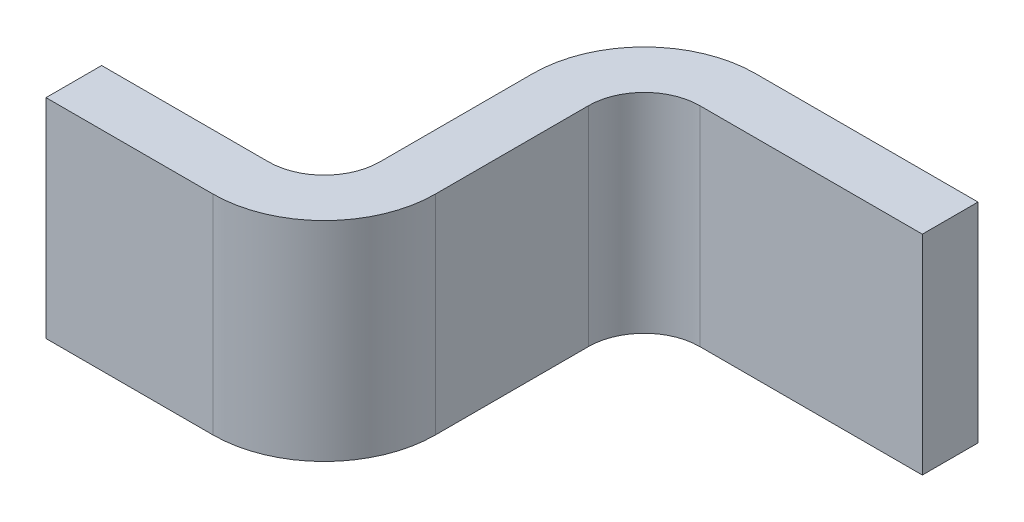
ISO-10303-21;
HEADER;
FILE_DESCRIPTION(('STEP AP214'),'2;1');
FILE_NAME('part.step','',(''),(''),'','','');
FILE_SCHEMA(('AUTOMOTIVE_DESIGN { 1 0 10303 214 1 1 1 1 }'));
ENDSEC;
DATA;
#1=APPLICATION_CONTEXT('core data for automotive mechanical design processes');
#2=APPLICATION_PROTOCOL_DEFINITION('international standard','automotive_design',2000,#1);
#3=PRODUCT_CONTEXT('',#1,'mechanical');
#4=PRODUCT('Part','Part','',(#3));
#5=PRODUCT_RELATED_PRODUCT_CATEGORY('part','',(#4));
#6=PRODUCT_DEFINITION_FORMATION('','',#4);
#7=PRODUCT_DEFINITION_CONTEXT('part definition',#1,'design');
#8=PRODUCT_DEFINITION('design','',#6,#7);
#9=PRODUCT_DEFINITION_SHAPE('','',#8);
#10=(LENGTH_UNIT() NAMED_UNIT(*) SI_UNIT(.MILLI.,.METRE.));
#11=(NAMED_UNIT(*) PLANE_ANGLE_UNIT() SI_UNIT($,.RADIAN.));
#12=(NAMED_UNIT(*) SI_UNIT($,.STERADIAN.) SOLID_ANGLE_UNIT());
#13=UNCERTAINTY_MEASURE_WITH_UNIT(LENGTH_MEASURE(1.E-05),#10,'distance_accuracy_value','');
#14=(GEOMETRIC_REPRESENTATION_CONTEXT(3) GLOBAL_UNCERTAINTY_ASSIGNED_CONTEXT((#13)) GLOBAL_UNIT_ASSIGNED_CONTEXT((#10,
#11,#12)) REPRESENTATION_CONTEXT('',''));
#15=CARTESIAN_POINT('',(0.,0.,0.));
#16=DIRECTION('',(0.,0.,1.));
#17=DIRECTION('',(1.,0.,0.));
#18=AXIS2_PLACEMENT_3D('',#15,#16,#17);
#19=CARTESIAN_POINT('',(0.,0.1875,0.675));
#20=DIRECTION('',(0.,0.,-1.));
#21=DIRECTION('',(-1.,0.,0.));
#22=AXIS2_PLACEMENT_3D('',#19,#20,#21);
#23=PLANE('',#22);
#24=DIRECTION('',(1.,0.,0.));
#25=VECTOR('',#24,1.);
#26=CARTESIAN_POINT('',(0.,0.1875,0.675));
#27=LINE('',#26,#25);
#28=CARTESIAN_POINT('',(0.3,0.1875,0.675));
#29=VERTEX_POINT('',#28);
#30=CARTESIAN_POINT('',(0.,0.1875,0.675));
#31=VERTEX_POINT('',#30);
#32=EDGE_CURVE('E104',#29,#31,#27,.F.);
#33=ORIENTED_EDGE('',*,*,#32,.T.);
#34=DIRECTION('',(0.,1.,0.));
#35=VECTOR('',#34,1.);
#36=CARTESIAN_POINT('',(0.,-0.1875,0.675));
#37=LINE('',#36,#35);
#38=CARTESIAN_POINT('',(0.,-0.1875,0.675));
#39=VERTEX_POINT('',#38);
#40=EDGE_CURVE('E113',#39,#31,#37,.T.);
#41=ORIENTED_EDGE('',*,*,#40,.F.);
#42=DIRECTION('',(1.,0.,0.));
#43=VECTOR('',#42,1.);
#44=CARTESIAN_POINT('',(0.,-0.1875,0.675));
#45=LINE('',#44,#43);
#46=CARTESIAN_POINT('',(0.3,-0.1875,0.675));
#47=VERTEX_POINT('',#46);
#48=EDGE_CURVE('E118',#39,#47,#45,.T.);
#49=ORIENTED_EDGE('',*,*,#48,.T.);
#50=DIRECTION('',(0.,1.,0.));
#51=VECTOR('',#50,1.);
#52=CARTESIAN_POINT('',(0.3,0.1875,0.675));
#53=LINE('',#52,#51);
#54=EDGE_CURVE('E116',#29,#47,#53,.F.);
#55=ORIENTED_EDGE('',*,*,#54,.F.);
#56=EDGE_LOOP('',(#33,#41,#49,#55));
#57=FACE_BOUND('',#56,.T.);
#58=ADVANCED_FACE('F17',(#57),#23,.F.);
#59=CARTESIAN_POINT('',(0.,-0.1875,0.575));
#60=DIRECTION('',(-1.,0.,0.));
#61=DIRECTION('',(0.,0.,1.));
#62=AXIS2_PLACEMENT_3D('',#59,#60,#61);
#63=PLANE('',#62);
#64=DIRECTION('',(0.,0.,1.));
#65=VECTOR('',#64,1.);
#66=CARTESIAN_POINT('',(0.,0.1875,0.575));
#67=LINE('',#66,#65);
#68=CARTESIAN_POINT('',(0.,0.1875,0.575));
#69=VERTEX_POINT('',#68);
#70=EDGE_CURVE('E111',#31,#69,#67,.F.);
#71=ORIENTED_EDGE('',*,*,#70,.T.);
#72=DIRECTION('',(0.,1.,0.));
#73=VECTOR('',#72,1.);
#74=CARTESIAN_POINT('',(0.,-0.1875,0.575));
#75=LINE('',#74,#73);
#76=CARTESIAN_POINT('',(0.,-0.1875,0.575));
#77=VERTEX_POINT('',#76);
#78=EDGE_CURVE('E127',#69,#77,#75,.F.);
#79=ORIENTED_EDGE('',*,*,#78,.T.);
#80=DIRECTION('',(0.,0.,1.));
#81=VECTOR('',#80,1.);
#82=CARTESIAN_POINT('',(0.,-0.1875,0.675));
#83=LINE('',#82,#81);
#84=EDGE_CURVE('E140',#77,#39,#83,.T.);
#85=ORIENTED_EDGE('',*,*,#84,.T.);
#86=ORIENTED_EDGE('',*,*,#40,.T.);
#87=EDGE_LOOP('',(#71,#79,#85,#86));
#88=FACE_BOUND('',#87,.T.);
#89=ADVANCED_FACE('F277',(#88),#63,.T.);
#90=CARTESIAN_POINT('',(0.3,0.1875,0.475));
#91=DIRECTION('',(0.,1.,0.));
#92=DIRECTION('',(0.,0.,1.));
#93=AXIS2_PLACEMENT_3D('',#90,#91,#92);
#94=CYLINDRICAL_SURFACE('',#93,0.2);
#95=CARTESIAN_POINT('',(0.3,0.1875,0.475));
#96=DIRECTION('',(0.,1.,0.));
#97=DIRECTION('',(0.,0.,1.));
#98=AXIS2_PLACEMENT_3D('',#95,#96,#97);
#99=CIRCLE('',#98,0.2);
#100=CARTESIAN_POINT('',(0.5,0.1875,0.475));
#101=VERTEX_POINT('',#100);
#102=EDGE_CURVE('E20',#29,#101,#99,.T.);
#103=ORIENTED_EDGE('',*,*,#102,.F.);
#104=ORIENTED_EDGE('',*,*,#54,.T.);
#105=CARTESIAN_POINT('',(0.3,-0.1875,0.475));
#106=DIRECTION('',(0.,1.,0.));
#107=DIRECTION('',(0.,0.,1.));
#108=AXIS2_PLACEMENT_3D('',#105,#106,#107);
#109=CIRCLE('',#108,0.2);
#110=CARTESIAN_POINT('',(0.5,-0.1875,0.475));
#111=VERTEX_POINT('',#110);
#112=EDGE_CURVE('E178',#111,#47,#109,.F.);
#113=ORIENTED_EDGE('',*,*,#112,.F.);
#114=DIRECTION('',(0.,1.,0.));
#115=VECTOR('',#114,1.);
#116=CARTESIAN_POINT('',(0.5,0.1875,0.475));
#117=LINE('',#116,#115);
#118=EDGE_CURVE('E124',#111,#101,#117,.T.);
#119=ORIENTED_EDGE('',*,*,#118,.T.);
#120=EDGE_LOOP('',(#103,#104,#113,#119));
#121=FACE_BOUND('',#120,.T.);
#122=ADVANCED_FACE('F123',(#121),#94,.T.);
#123=CARTESIAN_POINT('',(0.,-0.1875,0.575));
#124=DIRECTION('',(0.,0.,1.));
#125=DIRECTION('',(1.,0.,0.));
#126=AXIS2_PLACEMENT_3D('',#123,#124,#125);
#127=PLANE('',#126);
#128=DIRECTION('',(1.,0.,0.));
#129=VECTOR('',#128,1.);
#130=CARTESIAN_POINT('',(0.,-0.1875,0.575));
#131=LINE('',#130,#129);
#132=CARTESIAN_POINT('',(0.3,-0.1875,0.575));
#133=VERTEX_POINT('',#132);
#134=EDGE_CURVE('E131',#77,#133,#131,.T.);
#135=ORIENTED_EDGE('',*,*,#134,.F.);
#136=ORIENTED_EDGE('',*,*,#78,.F.);
#137=DIRECTION('',(1.,0.,0.));
#138=VECTOR('',#137,1.);
#139=CARTESIAN_POINT('',(0.,0.1875,0.575));
#140=LINE('',#139,#138);
#141=CARTESIAN_POINT('',(0.3,0.1875,0.575));
#142=VERTEX_POINT('',#141);
#143=EDGE_CURVE('E126',#142,#69,#140,.F.);
#144=ORIENTED_EDGE('',*,*,#143,.F.);
#145=DIRECTION('',(0.,1.,0.));
#146=VECTOR('',#145,1.);
#147=CARTESIAN_POINT('',(0.3,-0.1875,0.575));
#148=LINE('',#147,#146);
#149=EDGE_CURVE('E175',#142,#133,#148,.F.);
#150=ORIENTED_EDGE('',*,*,#149,.T.);
#151=EDGE_LOOP('',(#135,#136,#144,#150));
#152=FACE_BOUND('',#151,.T.);
#153=ADVANCED_FACE('F271',(#152),#127,.F.);
#154=CARTESIAN_POINT('',(0.5,0.1875,0.475));
#155=DIRECTION('',(-1.,0.,0.));
#156=DIRECTION('',(0.,0.,1.));
#157=AXIS2_PLACEMENT_3D('',#154,#155,#156);
#158=PLANE('',#157);
#159=DIRECTION('',(0.,0.,-1.));
#160=VECTOR('',#159,1.);
#161=CARTESIAN_POINT('',(0.5,0.1875,0.475));
#162=LINE('',#161,#160);
#163=CARTESIAN_POINT('',(0.5,0.1875,0.2));
#164=VERTEX_POINT('',#163);
#165=EDGE_CURVE('E177',#164,#101,#162,.F.);
#166=ORIENTED_EDGE('',*,*,#165,.T.);
#167=ORIENTED_EDGE('',*,*,#118,.F.);
#168=DIRECTION('',(0.,0.,1.));
#169=VECTOR('',#168,1.);
#170=CARTESIAN_POINT('',(0.5,-0.1875,0.475));
#171=LINE('',#170,#169);
#172=CARTESIAN_POINT('',(0.5,-0.1875,0.2));
#173=VERTEX_POINT('',#172);
#174=EDGE_CURVE('E174',#111,#173,#171,.F.);
#175=ORIENTED_EDGE('',*,*,#174,.T.);
#176=DIRECTION('',(0.,-1.,0.));
#177=VECTOR('',#176,1.);
#178=CARTESIAN_POINT('',(0.5,0.1875,0.2));
#179=LINE('',#178,#177);
#180=EDGE_CURVE('E171',#173,#164,#179,.F.);
#181=ORIENTED_EDGE('',*,*,#180,.T.);
#182=EDGE_LOOP('',(#166,#167,#175,#181));
#183=FACE_BOUND('',#182,.T.);
#184=ADVANCED_FACE('F267',(#183),#158,.F.);
#185=CARTESIAN_POINT('',(0.3,-0.1875,0.475));
#186=DIRECTION('',(0.,1.,0.));
#187=DIRECTION('',(0.,0.,1.));
#188=AXIS2_PLACEMENT_3D('',#185,#186,#187);
#189=CYLINDRICAL_SURFACE('',#188,0.1);
#190=CARTESIAN_POINT('',(0.3,-0.1875,0.475));
#191=DIRECTION('',(0.,1.,0.));
#192=DIRECTION('',(0.,0.,1.));
#193=AXIS2_PLACEMENT_3D('',#190,#191,#192);
#194=CIRCLE('',#193,0.1);
#195=CARTESIAN_POINT('',(0.4,-0.1875,0.475));
#196=VERTEX_POINT('',#195);
#197=EDGE_CURVE('E172',#133,#196,#194,.T.);
#198=ORIENTED_EDGE('',*,*,#197,.F.);
#199=ORIENTED_EDGE('',*,*,#149,.F.);
#200=CARTESIAN_POINT('',(0.3,0.1875,0.475));
#201=DIRECTION('',(0.,1.,0.));
#202=DIRECTION('',(0.,0.,1.));
#203=AXIS2_PLACEMENT_3D('',#200,#201,#202);
#204=CIRCLE('',#203,0.1);
#205=CARTESIAN_POINT('',(0.4,0.1875,0.475));
#206=VERTEX_POINT('',#205);
#207=EDGE_CURVE('E176',#206,#142,#204,.F.);
#208=ORIENTED_EDGE('',*,*,#207,.F.);
#209=DIRECTION('',(0.,1.,0.));
#210=VECTOR('',#209,1.);
#211=CARTESIAN_POINT('',(0.4,-0.1875,0.475));
#212=LINE('',#211,#210);
#213=EDGE_CURVE('E188',#206,#196,#212,.F.);
#214=ORIENTED_EDGE('',*,*,#213,.T.);
#215=EDGE_LOOP('',(#198,#199,#208,#214));
#216=FACE_BOUND('',#215,.T.);
#217=ADVANCED_FACE('F263',(#216),#189,.F.);
#218=CARTESIAN_POINT('',(0.6,0.1875,0.2));
#219=DIRECTION('',(0.,-1.,0.));
#220=DIRECTION('',(0.,0.,-1.));
#221=AXIS2_PLACEMENT_3D('',#218,#219,#220);
#222=CYLINDRICAL_SURFACE('',#221,0.1);
#223=CARTESIAN_POINT('',(0.6,0.1875,0.2));
#224=DIRECTION('',(0.,-1.,0.));
#225=DIRECTION('',(0.,0.,-1.));
#226=AXIS2_PLACEMENT_3D('',#223,#224,#225);
#227=CIRCLE('',#226,0.1);
#228=CARTESIAN_POINT('',(0.6,0.1875,0.1));
#229=VERTEX_POINT('',#228);
#230=EDGE_CURVE('E168',#164,#229,#227,.T.);
#231=ORIENTED_EDGE('',*,*,#230,.F.);
#232=ORIENTED_EDGE('',*,*,#180,.F.);
#233=CARTESIAN_POINT('',(0.6,-0.1875,0.2));
#234=DIRECTION('',(0.,-1.,0.));
#235=DIRECTION('',(0.,0.,-1.));
#236=AXIS2_PLACEMENT_3D('',#233,#234,#235);
#237=CIRCLE('',#236,0.1);
#238=CARTESIAN_POINT('',(0.6,-0.1875,0.1));
#239=VERTEX_POINT('',#238);
#240=EDGE_CURVE('E163',#239,#173,#237,.F.);
#241=ORIENTED_EDGE('',*,*,#240,.F.);
#242=DIRECTION('',(0.,1.,0.));
#243=VECTOR('',#242,1.);
#244=CARTESIAN_POINT('',(0.6,0.1875,0.1));
#245=LINE('',#244,#243);
#246=EDGE_CURVE('E166',#239,#229,#245,.T.);
#247=ORIENTED_EDGE('',*,*,#246,.T.);
#248=EDGE_LOOP('',(#231,#232,#241,#247));
#249=FACE_BOUND('',#248,.T.);
#250=ADVANCED_FACE('F259',(#249),#222,.F.);
#251=CARTESIAN_POINT('',(0.4,-0.1875,0.475));
#252=DIRECTION('',(1.,0.,0.));
#253=DIRECTION('',(0.,0.,-1.));
#254=AXIS2_PLACEMENT_3D('',#251,#252,#253);
#255=PLANE('',#254);
#256=DIRECTION('',(0.,0.,-1.));
#257=VECTOR('',#256,1.);
#258=CARTESIAN_POINT('',(0.4,-0.1875,0.475));
#259=LINE('',#258,#257);
#260=CARTESIAN_POINT('',(0.4,-0.1875,0.2));
#261=VERTEX_POINT('',#260);
#262=EDGE_CURVE('E167',#196,#261,#259,.T.);
#263=ORIENTED_EDGE('',*,*,#262,.F.);
#264=ORIENTED_EDGE('',*,*,#213,.F.);
#265=DIRECTION('',(0.,0.,-1.));
#266=VECTOR('',#265,1.);
#267=CARTESIAN_POINT('',(0.4,0.1875,0.475));
#268=LINE('',#267,#266);
#269=CARTESIAN_POINT('',(0.4,0.1875,0.2));
#270=VERTEX_POINT('',#269);
#271=EDGE_CURVE('E170',#270,#206,#268,.F.);
#272=ORIENTED_EDGE('',*,*,#271,.F.);
#273=DIRECTION('',(0.,-1.,0.));
#274=VECTOR('',#273,1.);
#275=CARTESIAN_POINT('',(0.4,-0.1875,0.2));
#276=LINE('',#275,#274);
#277=EDGE_CURVE('E159',#261,#270,#276,.F.);
#278=ORIENTED_EDGE('',*,*,#277,.F.);
#279=EDGE_LOOP('',(#263,#264,#272,#278));
#280=FACE_BOUND('',#279,.T.);
#281=ADVANCED_FACE('F255',(#280),#255,.F.);
#282=CARTESIAN_POINT('',(0.6,0.1875,0.1));
#283=DIRECTION('',(0.,0.,-1.));
#284=DIRECTION('',(-1.,0.,0.));
#285=AXIS2_PLACEMENT_3D('',#282,#283,#284);
#286=PLANE('',#285);
#287=DIRECTION('',(1.,0.,0.));
#288=VECTOR('',#287,1.);
#289=CARTESIAN_POINT('',(0.6,0.1875,0.1));
#290=LINE('',#289,#288);
#291=CARTESIAN_POINT('',(1.,0.1875,0.1));
#292=VERTEX_POINT('',#291);
#293=EDGE_CURVE('E162',#292,#229,#290,.F.);
#294=ORIENTED_EDGE('',*,*,#293,.T.);
#295=ORIENTED_EDGE('',*,*,#246,.F.);
#296=DIRECTION('',(1.,0.,0.));
#297=VECTOR('',#296,1.);
#298=CARTESIAN_POINT('',(0.6,-0.1875,0.1));
#299=LINE('',#298,#297);
#300=CARTESIAN_POINT('',(1.,-0.1875,0.1));
#301=VERTEX_POINT('',#300);
#302=EDGE_CURVE('E216',#239,#301,#299,.T.);
#303=ORIENTED_EDGE('',*,*,#302,.T.);
#304=DIRECTION('',(0.,1.,0.));
#305=VECTOR('',#304,1.);
#306=CARTESIAN_POINT('',(1.,-0.1875,0.1));
#307=LINE('',#306,#305);
#308=EDGE_CURVE('E197',#301,#292,#307,.T.);
#309=ORIENTED_EDGE('',*,*,#308,.T.);
#310=EDGE_LOOP('',(#294,#295,#303,#309));
#311=FACE_BOUND('',#310,.T.);
#312=ADVANCED_FACE('F252',(#311),#286,.F.);
#313=CARTESIAN_POINT('',(0.6,0.1875,0.));
#314=DIRECTION('',(0.,-1.,0.));
#315=DIRECTION('',(0.,0.,-1.));
#316=AXIS2_PLACEMENT_3D('',#313,#314,#315);
#317=PLANE('',#316);
#318=DIRECTION('',(1.,0.,0.));
#319=VECTOR('',#318,1.);
#320=CARTESIAN_POINT('',(0.6,0.1875,0.));
#321=LINE('',#320,#319);
#322=CARTESIAN_POINT('',(1.,0.1875,0.));
#323=VERTEX_POINT('',#322);
#324=CARTESIAN_POINT('',(0.6,0.1875,0.));
#325=VERTEX_POINT('',#324);
#326=EDGE_CURVE('E205',#323,#325,#321,.F.);
#327=ORIENTED_EDGE('',*,*,#326,.T.);
#328=CARTESIAN_POINT('',(0.6,0.1875,0.2));
#329=DIRECTION('',(0.,-1.,0.));
#330=DIRECTION('',(0.,0.,-1.));
#331=AXIS2_PLACEMENT_3D('',#328,#329,#330);
#332=CIRCLE('',#331,0.2);
#333=EDGE_CURVE('E160',#270,#325,#332,.T.);
#334=ORIENTED_EDGE('',*,*,#333,.F.);
#335=ORIENTED_EDGE('',*,*,#271,.T.);
#336=ORIENTED_EDGE('',*,*,#207,.T.);
#337=ORIENTED_EDGE('',*,*,#143,.T.);
#338=ORIENTED_EDGE('',*,*,#70,.F.);
#339=ORIENTED_EDGE('',*,*,#32,.F.);
#340=ORIENTED_EDGE('',*,*,#102,.T.);
#341=ORIENTED_EDGE('',*,*,#165,.F.);
#342=ORIENTED_EDGE('',*,*,#230,.T.);
#343=ORIENTED_EDGE('',*,*,#293,.F.);
#344=DIRECTION('',(0.,0.,1.));
#345=VECTOR('',#344,1.);
#346=CARTESIAN_POINT('',(1.,0.1875,0.));
#347=LINE('',#346,#345);
#348=EDGE_CURVE('E200',#292,#323,#347,.F.);
#349=ORIENTED_EDGE('',*,*,#348,.T.);
#350=EDGE_LOOP('',(#327,#334,#335,#336,#337,#338,#339,#340,#341,#342,#343,#349));
#351=FACE_BOUND('',#350,.T.);
#352=ADVANCED_FACE('F107',(#351),#317,.F.);
#353=CARTESIAN_POINT('',(0.6,-0.1875,0.2));
#354=DIRECTION('',(0.,-1.,0.));
#355=DIRECTION('',(0.,0.,-1.));
#356=AXIS2_PLACEMENT_3D('',#353,#354,#355);
#357=CYLINDRICAL_SURFACE('',#356,0.2);
#358=CARTESIAN_POINT('',(0.6,-0.1875,0.2));
#359=DIRECTION('',(0.,-1.,0.));
#360=DIRECTION('',(0.,0.,-1.));
#361=AXIS2_PLACEMENT_3D('',#358,#359,#360);
#362=CIRCLE('',#361,0.2);
#363=CARTESIAN_POINT('',(0.6,-0.1875,0.));
#364=VERTEX_POINT('',#363);
#365=EDGE_CURVE('E157',#364,#261,#362,.F.);
#366=ORIENTED_EDGE('',*,*,#365,.T.);
#367=ORIENTED_EDGE('',*,*,#277,.T.);
#368=ORIENTED_EDGE('',*,*,#333,.T.);
#369=DIRECTION('',(0.,1.,0.));
#370=VECTOR('',#369,1.);
#371=CARTESIAN_POINT('',(0.6,-0.1875,0.));
#372=LINE('',#371,#370);
#373=EDGE_CURVE('E211',#325,#364,#372,.F.);
#374=ORIENTED_EDGE('',*,*,#373,.T.);
#375=EDGE_LOOP('',(#366,#367,#368,#374));
#376=FACE_BOUND('',#375,.T.);
#377=ADVANCED_FACE('F233',(#376),#357,.T.);
#378=CARTESIAN_POINT('',(0.6,-0.1875,0.1));
#379=DIRECTION('',(0.,1.,0.));
#380=DIRECTION('',(0.,0.,1.));
#381=AXIS2_PLACEMENT_3D('',#378,#379,#380);
#382=PLANE('',#381);
#383=ORIENTED_EDGE('',*,*,#302,.F.);
#384=ORIENTED_EDGE('',*,*,#240,.T.);
#385=ORIENTED_EDGE('',*,*,#174,.F.);
#386=ORIENTED_EDGE('',*,*,#112,.T.);
#387=ORIENTED_EDGE('',*,*,#48,.F.);
#388=ORIENTED_EDGE('',*,*,#84,.F.);
#389=ORIENTED_EDGE('',*,*,#134,.T.);
#390=ORIENTED_EDGE('',*,*,#197,.T.);
#391=ORIENTED_EDGE('',*,*,#262,.T.);
#392=ORIENTED_EDGE('',*,*,#365,.F.);
#393=DIRECTION('',(1.,0.,0.));
#394=VECTOR('',#393,1.);
#395=CARTESIAN_POINT('',(0.6,-0.1875,0.));
#396=LINE('',#395,#394);
#397=CARTESIAN_POINT('',(1.,-0.1875,0.));
#398=VERTEX_POINT('',#397);
#399=EDGE_CURVE('E26',#364,#398,#396,.T.);
#400=ORIENTED_EDGE('',*,*,#399,.T.);
#401=DIRECTION('',(0.,0.,1.));
#402=VECTOR('',#401,1.);
#403=CARTESIAN_POINT('',(1.,-0.1875,0.));
#404=LINE('',#403,#402);
#405=EDGE_CURVE('E34',#398,#301,#404,.T.);
#406=ORIENTED_EDGE('',*,*,#405,.T.);
#407=EDGE_LOOP('',(#383,#384,#385,#386,#387,#388,#389,#390,#391,#392,#400,#406));
#408=FACE_BOUND('',#407,.T.);
#409=ADVANCED_FACE('F227',(#408),#382,.F.);
#410=CARTESIAN_POINT('',(1.,-0.1875,0.));
#411=DIRECTION('',(-1.,0.,0.));
#412=DIRECTION('',(0.,0.,1.));
#413=AXIS2_PLACEMENT_3D('',#410,#411,#412);
#414=PLANE('',#413);
#415=ORIENTED_EDGE('',*,*,#348,.F.);
#416=ORIENTED_EDGE('',*,*,#308,.F.);
#417=ORIENTED_EDGE('',*,*,#405,.F.);
#418=DIRECTION('',(0.,1.,0.));
#419=VECTOR('',#418,1.);
#420=CARTESIAN_POINT('',(1.,-0.1875,0.));
#421=LINE('',#420,#419);
#422=EDGE_CURVE('E11',#398,#323,#421,.T.);
#423=ORIENTED_EDGE('',*,*,#422,.T.);
#424=EDGE_LOOP('',(#415,#416,#417,#423));
#425=FACE_BOUND('',#424,.T.);
#426=ADVANCED_FACE('F237',(#425),#414,.F.);
#427=CARTESIAN_POINT('',(0.6,-0.1875,0.));
#428=DIRECTION('',(0.,0.,1.));
#429=DIRECTION('',(1.,0.,0.));
#430=AXIS2_PLACEMENT_3D('',#427,#428,#429);
#431=PLANE('',#430);
#432=ORIENTED_EDGE('',*,*,#399,.F.);
#433=ORIENTED_EDGE('',*,*,#373,.F.);
#434=ORIENTED_EDGE('',*,*,#326,.F.);
#435=ORIENTED_EDGE('',*,*,#422,.F.);
#436=EDGE_LOOP('',(#432,#433,#434,#435));
#437=FACE_BOUND('',#436,.T.);
#438=ADVANCED_FACE('F231',(#437),#431,.F.);
#439=CLOSED_SHELL('',(#58,#89,#122,#153,#184,#217,#250,#281,#312,#352,#377,#409,#426,#438));
#440=MANIFOLD_SOLID_BREP('B1',#439);
#441=ADVANCED_BREP_SHAPE_REPRESENTATION('',(#18,#440),#14);
#442=SHAPE_DEFINITION_REPRESENTATION(#9,#441);
ENDSEC;
END-ISO-10303-21;
